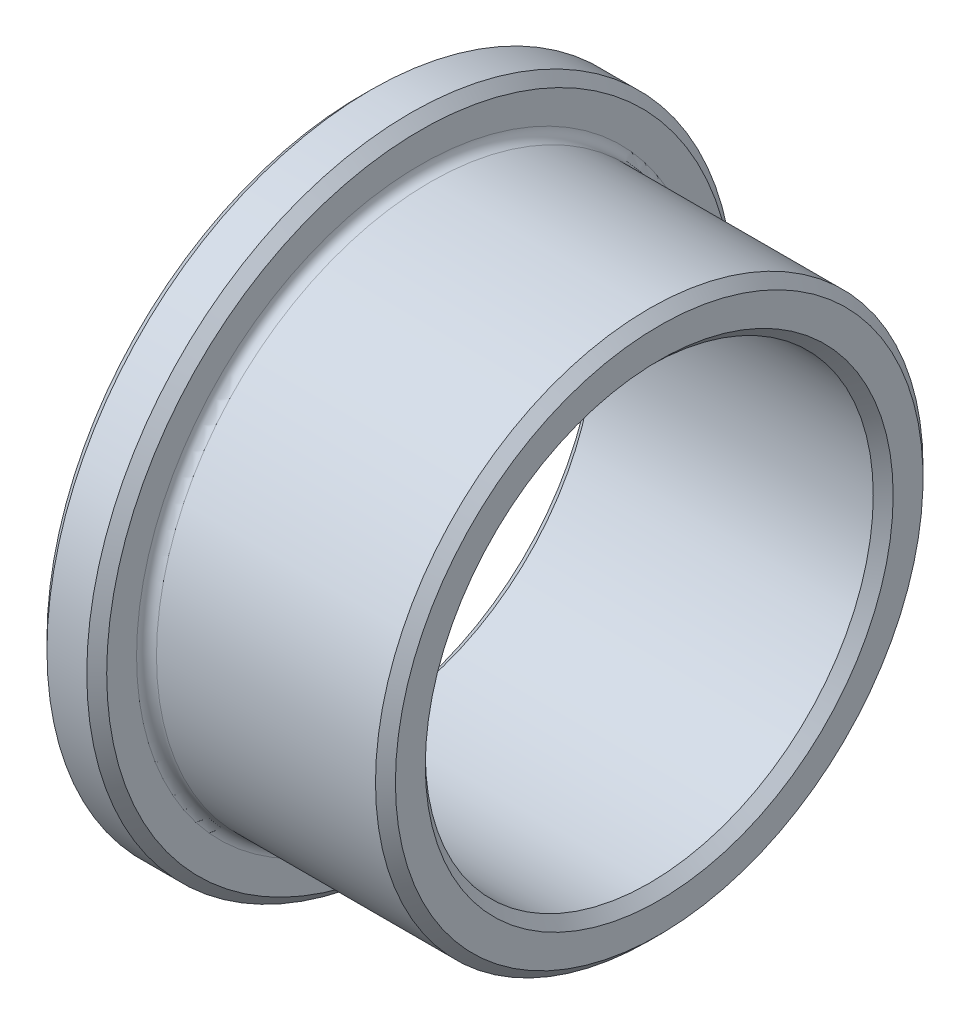
ISO-10303-21;
HEADER;
FILE_DESCRIPTION(('STEP AP214'),'2;1');
FILE_NAME('part.step','',(''),(''),'','','');
FILE_SCHEMA(('AUTOMOTIVE_DESIGN { 1 0 10303 214 1 1 1 1 }'));
ENDSEC;
DATA;
#1=APPLICATION_CONTEXT('core data for automotive mechanical design processes');
#2=APPLICATION_PROTOCOL_DEFINITION('international standard','automotive_design',2000,#1);
#3=PRODUCT_CONTEXT('',#1,'mechanical');
#4=PRODUCT('Part','Part','',(#3));
#5=PRODUCT_RELATED_PRODUCT_CATEGORY('part','',(#4));
#6=PRODUCT_DEFINITION_FORMATION('','',#4);
#7=PRODUCT_DEFINITION_CONTEXT('part definition',#1,'design');
#8=PRODUCT_DEFINITION('design','',#6,#7);
#9=PRODUCT_DEFINITION_SHAPE('','',#8);
#10=(LENGTH_UNIT() NAMED_UNIT(*) SI_UNIT(.MILLI.,.METRE.));
#11=(NAMED_UNIT(*) PLANE_ANGLE_UNIT() SI_UNIT($,.RADIAN.));
#12=(NAMED_UNIT(*) SI_UNIT($,.STERADIAN.) SOLID_ANGLE_UNIT());
#13=UNCERTAINTY_MEASURE_WITH_UNIT(LENGTH_MEASURE(1.E-05),#10,'distance_accuracy_value','');
#14=(GEOMETRIC_REPRESENTATION_CONTEXT(3) GLOBAL_UNCERTAINTY_ASSIGNED_CONTEXT((#13)) GLOBAL_UNIT_ASSIGNED_CONTEXT((#10,
#11,#12)) REPRESENTATION_CONTEXT('',''));
#15=CARTESIAN_POINT('',(0.,0.,0.));
#16=DIRECTION('',(0.,0.,1.));
#17=DIRECTION('',(1.,0.,0.));
#18=AXIS2_PLACEMENT_3D('',#15,#16,#17);
#19=CARTESIAN_POINT('',(0.,32.5,0.));
#20=DIRECTION('',(1.,0.,0.));
#21=DIRECTION('',(0.,0.,-1.));
#22=AXIS2_PLACEMENT_3D('',#19,#20,#21);
#23=PLANE('',#22);
#24=CARTESIAN_POINT('',(0.,0.,0.));
#25=DIRECTION('',(1.,0.,0.));
#26=DIRECTION('',(0.,0.,-1.));
#27=AXIS2_PLACEMENT_3D('',#24,#25,#26);
#28=CIRCLE('',#27,23.5);
#29=CARTESIAN_POINT('',(0.,0.,-23.5));
#30=VERTEX_POINT('',#29);
#31=EDGE_CURVE('E65',#30,#30,#28,.T.);
#32=ORIENTED_EDGE('',*,*,#31,.T.);
#33=EDGE_LOOP('',(#32));
#34=FACE_BOUND('',#33,.T.);
#35=CARTESIAN_POINT('',(0.,0.,0.));
#36=DIRECTION('',(1.,0.,0.));
#37=DIRECTION('',(0.,0.,-1.));
#38=AXIS2_PLACEMENT_3D('',#35,#36,#37);
#39=CIRCLE('',#38,31.5);
#40=CARTESIAN_POINT('',(0.,0.,-31.5));
#41=VERTEX_POINT('',#40);
#42=EDGE_CURVE('E68',#41,#41,#39,.F.);
#43=ORIENTED_EDGE('',*,*,#42,.T.);
#44=EDGE_LOOP('',(#43));
#45=FACE_BOUND('',#44,.T.);
#46=ADVANCED_FACE('F33',(#34,#45),#23,.F.);
#47=CARTESIAN_POINT('',(0.,0.,0.));
#48=DIRECTION('',(-1.,0.,0.));
#49=DIRECTION('',(0.,0.,1.));
#50=AXIS2_PLACEMENT_3D('',#47,#48,#49);
#51=CYLINDRICAL_SURFACE('',#50,22.5);
#52=CARTESIAN_POINT('',(0.999999999999991,0.,0.));
#53=DIRECTION('',(1.,0.,0.));
#54=DIRECTION('',(0.,0.,-1.));
#55=AXIS2_PLACEMENT_3D('',#52,#53,#54);
#56=CIRCLE('',#55,22.5);
#57=CARTESIAN_POINT('',(0.999999999999991,0.,-22.5));
#58=VERTEX_POINT('',#57);
#59=EDGE_CURVE('E71',#58,#58,#56,.F.);
#60=ORIENTED_EDGE('',*,*,#59,.T.);
#61=EDGE_LOOP('',(#60));
#62=FACE_BOUND('',#61,.T.);
#63=CARTESIAN_POINT('',(29.,0.,0.));
#64=DIRECTION('',(-1.,0.,0.));
#65=DIRECTION('',(0.,0.,1.));
#66=AXIS2_PLACEMENT_3D('',#63,#64,#65);
#67=CIRCLE('',#66,22.5);
#68=CARTESIAN_POINT('',(29.,0.,22.5));
#69=VERTEX_POINT('',#68);
#70=EDGE_CURVE('E74',#69,#69,#67,.F.);
#71=ORIENTED_EDGE('',*,*,#70,.T.);
#72=EDGE_LOOP('',(#71));
#73=FACE_BOUND('',#72,.T.);
#74=ADVANCED_FACE('F78',(#62,#73),#51,.F.);
#75=CARTESIAN_POINT('',(30.,22.5,0.));
#76=DIRECTION('',(-1.,0.,0.));
#77=DIRECTION('',(0.,0.,1.));
#78=AXIS2_PLACEMENT_3D('',#75,#76,#77);
#79=PLANE('',#78);
#80=CARTESIAN_POINT('',(30.,0.,0.));
#81=DIRECTION('',(-1.,0.,0.));
#82=DIRECTION('',(0.,0.,1.));
#83=AXIS2_PLACEMENT_3D('',#80,#81,#82);
#84=CIRCLE('',#83,23.5);
#85=CARTESIAN_POINT('',(30.,0.,23.5));
#86=VERTEX_POINT('',#85);
#87=EDGE_CURVE('E59',#86,#86,#84,.T.);
#88=ORIENTED_EDGE('',*,*,#87,.T.);
#89=EDGE_LOOP('',(#88));
#90=FACE_BOUND('',#89,.T.);
#91=CARTESIAN_POINT('',(30.,0.,0.));
#92=DIRECTION('',(-1.,0.,0.));
#93=DIRECTION('',(0.,0.,1.));
#94=AXIS2_PLACEMENT_3D('',#91,#92,#93);
#95=CIRCLE('',#94,26.5);
#96=CARTESIAN_POINT('',(30.,0.,26.5));
#97=VERTEX_POINT('',#96);
#98=EDGE_CURVE('E62',#97,#97,#95,.F.);
#99=ORIENTED_EDGE('',*,*,#98,.T.);
#100=EDGE_LOOP('',(#99));
#101=FACE_BOUND('',#100,.T.);
#102=ADVANCED_FACE('F88',(#90,#101),#79,.F.);
#103=CARTESIAN_POINT('',(0.,0.,0.));
#104=DIRECTION('',(-1.,0.,0.));
#105=DIRECTION('',(0.,0.,1.));
#106=AXIS2_PLACEMENT_3D('',#103,#104,#105);
#107=CYLINDRICAL_SURFACE('',#106,27.5);
#108=CARTESIAN_POINT('',(7.,0.,0.));
#109=DIRECTION('',(-1.,0.,0.));
#110=DIRECTION('',(0.,0.,1.));
#111=AXIS2_PLACEMENT_3D('',#108,#109,#110);
#112=CIRCLE('',#111,27.5);
#113=CARTESIAN_POINT('',(7.,0.,27.5));
#114=VERTEX_POINT('',#113);
#115=EDGE_CURVE('E10',#114,#114,#112,.F.);
#116=ORIENTED_EDGE('',*,*,#115,.T.);
#117=EDGE_LOOP('',(#116));
#118=FACE_BOUND('',#117,.T.);
#119=CARTESIAN_POINT('',(29.,0.,0.));
#120=DIRECTION('',(-1.,0.,0.));
#121=DIRECTION('',(0.,0.,1.));
#122=AXIS2_PLACEMENT_3D('',#119,#120,#121);
#123=CIRCLE('',#122,27.5);
#124=CARTESIAN_POINT('',(29.,0.,27.5));
#125=VERTEX_POINT('',#124);
#126=EDGE_CURVE('E44',#125,#125,#123,.T.);
#127=ORIENTED_EDGE('',*,*,#126,.T.);
#128=EDGE_LOOP('',(#127));
#129=FACE_BOUND('',#128,.T.);
#130=ADVANCED_FACE('F91',(#118,#129),#107,.T.);
#131=CARTESIAN_POINT('',(6.,27.5,0.));
#132=DIRECTION('',(-1.,0.,0.));
#133=DIRECTION('',(0.,0.,1.));
#134=AXIS2_PLACEMENT_3D('',#131,#132,#133);
#135=PLANE('',#134);
#136=CARTESIAN_POINT('',(6.,0.,0.));
#137=DIRECTION('',(-1.,0.,0.));
#138=DIRECTION('',(0.,0.,1.));
#139=AXIS2_PLACEMENT_3D('',#136,#137,#138);
#140=CIRCLE('',#139,28.5);
#141=CARTESIAN_POINT('',(6.,0.,28.5));
#142=VERTEX_POINT('',#141);
#143=EDGE_CURVE('E40',#142,#142,#140,.T.);
#144=ORIENTED_EDGE('',*,*,#143,.T.);
#145=EDGE_LOOP('',(#144));
#146=FACE_BOUND('',#145,.T.);
#147=CARTESIAN_POINT('',(6.,0.,0.));
#148=DIRECTION('',(-1.,0.,0.));
#149=DIRECTION('',(0.,0.,1.));
#150=AXIS2_PLACEMENT_3D('',#147,#148,#149);
#151=CIRCLE('',#150,31.5);
#152=CARTESIAN_POINT('',(6.,0.,31.5));
#153=VERTEX_POINT('',#152);
#154=EDGE_CURVE('E48',#153,#153,#151,.F.);
#155=ORIENTED_EDGE('',*,*,#154,.T.);
#156=EDGE_LOOP('',(#155));
#157=FACE_BOUND('',#156,.T.);
#158=ADVANCED_FACE('F102',(#146,#157),#135,.F.);
#159=CARTESIAN_POINT('',(0.,0.,0.));
#160=DIRECTION('',(-1.,0.,0.));
#161=DIRECTION('',(0.,0.,1.));
#162=AXIS2_PLACEMENT_3D('',#159,#160,#161);
#163=CYLINDRICAL_SURFACE('',#162,32.5);
#164=CARTESIAN_POINT('',(5.,0.,0.));
#165=DIRECTION('',(-1.,0.,0.));
#166=DIRECTION('',(0.,0.,1.));
#167=AXIS2_PLACEMENT_3D('',#164,#165,#166);
#168=CIRCLE('',#167,32.5);
#169=CARTESIAN_POINT('',(5.,0.,32.5));
#170=VERTEX_POINT('',#169);
#171=EDGE_CURVE('E53',#170,#170,#168,.T.);
#172=ORIENTED_EDGE('',*,*,#171,.T.);
#173=EDGE_LOOP('',(#172));
#174=FACE_BOUND('',#173,.T.);
#175=CARTESIAN_POINT('',(1.00000000000001,0.,0.));
#176=DIRECTION('',(1.,0.,0.));
#177=DIRECTION('',(0.,0.,-1.));
#178=AXIS2_PLACEMENT_3D('',#175,#176,#177);
#179=CIRCLE('',#178,32.5);
#180=CARTESIAN_POINT('',(1.00000000000001,0.,-32.5));
#181=VERTEX_POINT('',#180);
#182=EDGE_CURVE('E56',#181,#181,#179,.T.);
#183=ORIENTED_EDGE('',*,*,#182,.T.);
#184=EDGE_LOOP('',(#183));
#185=FACE_BOUND('',#184,.T.);
#186=ADVANCED_FACE('F107',(#174,#185),#163,.T.);
#187=CARTESIAN_POINT('',(0.999999999999991,0.,0.));
#188=DIRECTION('',(-1.,0.,0.));
#189=DIRECTION('',(0.,0.,1.));
#190=AXIS2_PLACEMENT_3D('',#187,#188,#189);
#191=CONICAL_SURFACE('',#190,22.5,0.78539816339745);
#192=ORIENTED_EDGE('',*,*,#31,.F.);
#193=EDGE_LOOP('',(#192));
#194=FACE_BOUND('',#193,.T.);
#195=ORIENTED_EDGE('',*,*,#59,.F.);
#196=EDGE_LOOP('',(#195));
#197=FACE_BOUND('',#196,.T.);
#198=ADVANCED_FACE('F84',(#194,#197),#191,.F.);
#199=CARTESIAN_POINT('',(30.,0.,0.));
#200=DIRECTION('',(1.,0.,0.));
#201=DIRECTION('',(0.,0.,-1.));
#202=AXIS2_PLACEMENT_3D('',#199,#200,#201);
#203=CONICAL_SURFACE('',#202,23.5,0.785398163397448);
#204=ORIENTED_EDGE('',*,*,#70,.F.);
#205=EDGE_LOOP('',(#204));
#206=FACE_BOUND('',#205,.T.);
#207=ORIENTED_EDGE('',*,*,#87,.F.);
#208=EDGE_LOOP('',(#207));
#209=FACE_BOUND('',#208,.T.);
#210=ADVANCED_FACE('F80',(#206,#209),#203,.F.);
#211=CARTESIAN_POINT('',(5.,0.,0.));
#212=DIRECTION('',(-1.,0.,0.));
#213=DIRECTION('',(0.,0.,1.));
#214=AXIS2_PLACEMENT_3D('',#211,#212,#213);
#215=CONICAL_SURFACE('',#214,32.5,0.785398163397452);
#216=ORIENTED_EDGE('',*,*,#154,.F.);
#217=EDGE_LOOP('',(#216));
#218=FACE_BOUND('',#217,.T.);
#219=ORIENTED_EDGE('',*,*,#171,.F.);
#220=EDGE_LOOP('',(#219));
#221=FACE_BOUND('',#220,.T.);
#222=ADVANCED_FACE('F83',(#218,#221),#215,.T.);
#223=CARTESIAN_POINT('',(0.,0.,0.));
#224=DIRECTION('',(1.,0.,0.));
#225=DIRECTION('',(0.,0.,-1.));
#226=AXIS2_PLACEMENT_3D('',#223,#224,#225);
#227=CONICAL_SURFACE('',#226,31.5,0.785398163397445);
#228=ORIENTED_EDGE('',*,*,#182,.F.);
#229=EDGE_LOOP('',(#228));
#230=FACE_BOUND('',#229,.T.);
#231=ORIENTED_EDGE('',*,*,#42,.F.);
#232=EDGE_LOOP('',(#231));
#233=FACE_BOUND('',#232,.T.);
#234=ADVANCED_FACE('F98',(#230,#233),#227,.T.);
#235=CARTESIAN_POINT('',(29.,0.,0.));
#236=DIRECTION('',(-1.,0.,0.));
#237=DIRECTION('',(0.,0.,1.));
#238=AXIS2_PLACEMENT_3D('',#235,#236,#237);
#239=CONICAL_SURFACE('',#238,27.5,0.78539816339745);
#240=ORIENTED_EDGE('',*,*,#98,.F.);
#241=EDGE_LOOP('',(#240));
#242=FACE_BOUND('',#241,.T.);
#243=ORIENTED_EDGE('',*,*,#126,.F.);
#244=EDGE_LOOP('',(#243));
#245=FACE_BOUND('',#244,.T.);
#246=ADVANCED_FACE('F95',(#242,#245),#239,.T.);
#247=CARTESIAN_POINT('',(7.,0.,0.));
#248=DIRECTION('',(-1.,0.,0.));
#249=DIRECTION('',(0.,0.,1.));
#250=AXIS2_PLACEMENT_3D('',#247,#248,#249);
#251=TOROIDAL_SURFACE('',#250,28.5,1.);
#252=ORIENTED_EDGE('',*,*,#115,.F.);
#253=EDGE_LOOP('',(#252));
#254=FACE_BOUND('',#253,.T.);
#255=ORIENTED_EDGE('',*,*,#143,.F.);
#256=EDGE_LOOP('',(#255));
#257=FACE_BOUND('',#256,.T.);
#258=ADVANCED_FACE('F35',(#254,#257),#251,.F.);
#259=CLOSED_SHELL('',(#46,#74,#102,#130,#158,#186,#198,#210,#222,#234,#246,#258));
#260=MANIFOLD_SOLID_BREP('B2',#259);
#261=ADVANCED_BREP_SHAPE_REPRESENTATION('',(#18,#260),#14);
#262=SHAPE_DEFINITION_REPRESENTATION(#9,#261);
ENDSEC;
END-ISO-10303-21;
